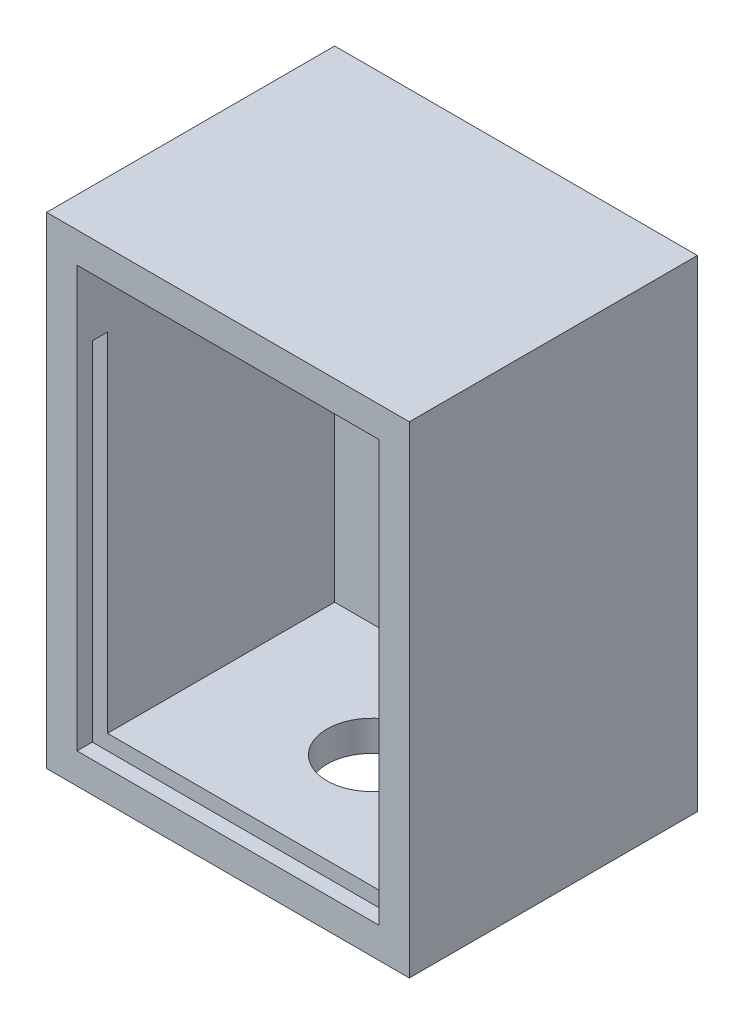
ISO-10303-21;
HEADER;
FILE_DESCRIPTION(('STEP AP214'),'2;1');
FILE_NAME('part.step','',(''),(''),'','','');
FILE_SCHEMA(('AUTOMOTIVE_DESIGN { 1 0 10303 214 1 1 1 1 }'));
ENDSEC;
DATA;
#1=APPLICATION_CONTEXT('core data for automotive mechanical design processes');
#2=APPLICATION_PROTOCOL_DEFINITION('international standard','automotive_design',2000,#1);
#3=PRODUCT_CONTEXT('',#1,'mechanical');
#4=PRODUCT('Part','Part','',(#3));
#5=PRODUCT_RELATED_PRODUCT_CATEGORY('part','',(#4));
#6=PRODUCT_DEFINITION_FORMATION('','',#4);
#7=PRODUCT_DEFINITION_CONTEXT('part definition',#1,'design');
#8=PRODUCT_DEFINITION('design','',#6,#7);
#9=PRODUCT_DEFINITION_SHAPE('','',#8);
#10=(LENGTH_UNIT() NAMED_UNIT(*) SI_UNIT(.MILLI.,.METRE.));
#11=(NAMED_UNIT(*) PLANE_ANGLE_UNIT() SI_UNIT($,.RADIAN.));
#12=(NAMED_UNIT(*) SI_UNIT($,.STERADIAN.) SOLID_ANGLE_UNIT());
#13=UNCERTAINTY_MEASURE_WITH_UNIT(LENGTH_MEASURE(1.E-05),#10,'distance_accuracy_value','');
#14=(GEOMETRIC_REPRESENTATION_CONTEXT(3) GLOBAL_UNCERTAINTY_ASSIGNED_CONTEXT((#13)) GLOBAL_UNIT_ASSIGNED_CONTEXT((#10,
#11,#12)) REPRESENTATION_CONTEXT('',''));
#15=CARTESIAN_POINT('',(0.,0.,0.));
#16=DIRECTION('',(0.,0.,1.));
#17=DIRECTION('',(1.,0.,0.));
#18=AXIS2_PLACEMENT_3D('',#15,#16,#17);
#19=CARTESIAN_POINT('',(0.,2.,0.));
#20=DIRECTION('',(0.,1.,0.));
#21=DIRECTION('',(0.,0.,1.));
#22=AXIS2_PLACEMENT_3D('',#19,#20,#21);
#23=PLANE('',#22);
#24=DIRECTION('',(1.,0.,0.));
#25=VECTOR('',#24,1.);
#26=CARTESIAN_POINT('',(0.,2.,26.6900146945383));
#27=LINE('',#26,#25);
#28=CARTESIAN_POINT('',(-94.7792504961823,2.,26.6900146945383));
#29=VERTEX_POINT('',#28);
#30=CARTESIAN_POINT('',(-74.9792504961823,2.,26.6900146945383));
#31=VERTEX_POINT('',#30);
#32=EDGE_CURVE('E55',#29,#31,#27,.T.);
#33=ORIENTED_EDGE('',*,*,#32,.F.);
#34=DIRECTION('',(0.,0.,1.));
#35=VECTOR('',#34,1.);
#36=CARTESIAN_POINT('',(-94.7792504961823,2.,8.79001469453827));
#37=LINE('',#36,#35);
#38=CARTESIAN_POINT('',(-94.7792504961823,2.,27.6900146945383));
#39=VERTEX_POINT('',#38);
#40=EDGE_CURVE('E215',#29,#39,#37,.T.);
#41=ORIENTED_EDGE('',*,*,#40,.T.);
#42=DIRECTION('',(1.,0.,0.));
#43=VECTOR('',#42,1.);
#44=CARTESIAN_POINT('',(-96.7792504961823,2.,27.6900146945383));
#45=LINE('',#44,#43);
#46=CARTESIAN_POINT('',(-74.9792504961823,2.,27.6900146945383));
#47=VERTEX_POINT('',#46);
#48=EDGE_CURVE('E219',#39,#47,#45,.T.);
#49=ORIENTED_EDGE('',*,*,#48,.T.);
#50=DIRECTION('',(0.,0.,1.));
#51=VECTOR('',#50,1.);
#52=CARTESIAN_POINT('',(-74.9792504961823,2.,8.79001469453827));
#53=LINE('',#52,#51);
#54=EDGE_CURVE('E238',#31,#47,#53,.T.);
#55=ORIENTED_EDGE('',*,*,#54,.F.);
#56=EDGE_LOOP('',(#33,#41,#49,#55));
#57=FACE_BOUND('',#56,.T.);
#58=ADVANCED_FACE('F47',(#57),#23,.T.);
#59=CARTESIAN_POINT('',(-96.7792504961823,31.6,27.6900146945383));
#60=DIRECTION('',(0.,0.,-1.));
#61=DIRECTION('',(-1.,0.,0.));
#62=AXIS2_PLACEMENT_3D('',#59,#60,#61);
#63=PLANE('',#62);
#64=DIRECTION('',(1.,0.,0.));
#65=VECTOR('',#64,1.);
#66=CARTESIAN_POINT('',(-96.7792504961823,0.,27.6900146945383));
#67=LINE('',#66,#65);
#68=CARTESIAN_POINT('',(-96.7792504961823,0.,27.6900146945383));
#69=VERTEX_POINT('',#68);
#70=CARTESIAN_POINT('',(-72.9792504961823,0.,27.6900146945383));
#71=VERTEX_POINT('',#70);
#72=EDGE_CURVE('E266',#69,#71,#67,.T.);
#73=ORIENTED_EDGE('',*,*,#72,.T.);
#74=DIRECTION('',(0.,-1.,0.));
#75=VECTOR('',#74,1.);
#76=CARTESIAN_POINT('',(-72.9792504961823,31.6,27.6900146945383));
#77=LINE('',#76,#75);
#78=CARTESIAN_POINT('',(-72.9792504961823,31.6,27.6900146945383));
#79=VERTEX_POINT('',#78);
#80=EDGE_CURVE('E277',#79,#71,#77,.T.);
#81=ORIENTED_EDGE('',*,*,#80,.F.);
#82=DIRECTION('',(1.,0.,0.));
#83=VECTOR('',#82,1.);
#84=CARTESIAN_POINT('',(-96.7792504961823,31.6,27.6900146945383));
#85=LINE('',#84,#83);
#86=CARTESIAN_POINT('',(-96.7792504961823,31.6,27.6900146945383));
#87=VERTEX_POINT('',#86);
#88=EDGE_CURVE('E254',#87,#79,#85,.T.);
#89=ORIENTED_EDGE('',*,*,#88,.F.);
#90=DIRECTION('',(0.,-1.,0.));
#91=VECTOR('',#90,1.);
#92=CARTESIAN_POINT('',(-96.7792504961823,31.6,27.6900146945383));
#93=LINE('',#92,#91);
#94=EDGE_CURVE('E279',#87,#69,#93,.T.);
#95=ORIENTED_EDGE('',*,*,#94,.T.);
#96=EDGE_LOOP('',(#73,#81,#89,#95));
#97=FACE_BOUND('',#96,.T.);
#98=ORIENTED_EDGE('',*,*,#48,.F.);
#99=DIRECTION('',(0.,-1.,0.));
#100=VECTOR('',#99,1.);
#101=CARTESIAN_POINT('',(-94.7792504961823,31.6,27.6900146945383));
#102=LINE('',#101,#100);
#103=CARTESIAN_POINT('',(-94.7792504961823,29.6,27.6900146945383));
#104=VERTEX_POINT('',#103);
#105=EDGE_CURVE('E241',#104,#39,#102,.T.);
#106=ORIENTED_EDGE('',*,*,#105,.F.);
#107=DIRECTION('',(1.,0.,0.));
#108=VECTOR('',#107,1.);
#109=CARTESIAN_POINT('',(-96.7792504961823,29.6,27.6900146945383));
#110=LINE('',#109,#108);
#111=CARTESIAN_POINT('',(-74.9792504961823,29.6,27.6900146945383));
#112=VERTEX_POINT('',#111);
#113=EDGE_CURVE('E222',#104,#112,#110,.T.);
#114=ORIENTED_EDGE('',*,*,#113,.T.);
#115=DIRECTION('',(0.,-1.,0.));
#116=VECTOR('',#115,1.);
#117=CARTESIAN_POINT('',(-74.9792504961823,31.6,27.6900146945383));
#118=LINE('',#117,#116);
#119=EDGE_CURVE('E235',#112,#47,#118,.T.);
#120=ORIENTED_EDGE('',*,*,#119,.T.);
#121=EDGE_LOOP('',(#98,#106,#114,#120));
#122=FACE_BOUND('',#121,.T.);
#123=ADVANCED_FACE('F297',(#97,#122),#63,.F.);
#124=CARTESIAN_POINT('',(-96.7792504961823,31.6,8.79001469453827));
#125=DIRECTION('',(1.,0.,0.));
#126=DIRECTION('',(0.,0.,-1.));
#127=AXIS2_PLACEMENT_3D('',#124,#125,#126);
#128=PLANE('',#127);
#129=DIRECTION('',(0.,0.,1.));
#130=VECTOR('',#129,1.);
#131=CARTESIAN_POINT('',(-96.7792504961823,0.,8.79001469453827));
#132=LINE('',#131,#130);
#133=CARTESIAN_POINT('',(-96.7792504961823,0.,8.79001469453827));
#134=VERTEX_POINT('',#133);
#135=EDGE_CURVE('E244',#134,#69,#132,.T.);
#136=ORIENTED_EDGE('',*,*,#135,.T.);
#137=ORIENTED_EDGE('',*,*,#94,.F.);
#138=DIRECTION('',(0.,0.,1.));
#139=VECTOR('',#138,1.);
#140=CARTESIAN_POINT('',(-96.7792504961823,31.6,8.79001469453827));
#141=LINE('',#140,#139);
#142=CARTESIAN_POINT('',(-96.7792504961823,31.6,8.79001469453827));
#143=VERTEX_POINT('',#142);
#144=EDGE_CURVE('E251',#143,#87,#141,.T.);
#145=ORIENTED_EDGE('',*,*,#144,.F.);
#146=DIRECTION('',(0.,-1.,0.));
#147=VECTOR('',#146,1.);
#148=CARTESIAN_POINT('',(-96.7792504961823,31.6,8.79001469453827));
#149=LINE('',#148,#147);
#150=EDGE_CURVE('E263',#143,#134,#149,.T.);
#151=ORIENTED_EDGE('',*,*,#150,.T.);
#152=EDGE_LOOP('',(#136,#137,#145,#151));
#153=FACE_BOUND('',#152,.T.);
#154=ADVANCED_FACE('F49',(#153),#128,.F.);
#155=CARTESIAN_POINT('',(-72.9792504961823,31.6,8.79001469453827));
#156=DIRECTION('',(1.,0.,0.));
#157=DIRECTION('',(0.,0.,-1.));
#158=AXIS2_PLACEMENT_3D('',#155,#156,#157);
#159=PLANE('',#158);
#160=DIRECTION('',(0.,0.,1.));
#161=VECTOR('',#160,1.);
#162=CARTESIAN_POINT('',(-72.9792504961823,0.,8.79001469453827));
#163=LINE('',#162,#161);
#164=CARTESIAN_POINT('',(-72.9792504961823,0.,8.79001469453827));
#165=VERTEX_POINT('',#164);
#166=EDGE_CURVE('E269',#165,#71,#163,.T.);
#167=ORIENTED_EDGE('',*,*,#166,.F.);
#168=DIRECTION('',(0.,-1.,0.));
#169=VECTOR('',#168,1.);
#170=CARTESIAN_POINT('',(-72.9792504961823,31.6,8.79001469453827));
#171=LINE('',#170,#169);
#172=CARTESIAN_POINT('',(-72.9792504961823,31.6,8.79001469453827));
#173=VERTEX_POINT('',#172);
#174=EDGE_CURVE('E275',#173,#165,#171,.T.);
#175=ORIENTED_EDGE('',*,*,#174,.F.);
#176=DIRECTION('',(0.,0.,1.));
#177=VECTOR('',#176,1.);
#178=CARTESIAN_POINT('',(-72.9792504961823,31.6,8.79001469453827));
#179=LINE('',#178,#177);
#180=EDGE_CURVE('E257',#173,#79,#179,.T.);
#181=ORIENTED_EDGE('',*,*,#180,.T.);
#182=ORIENTED_EDGE('',*,*,#80,.T.);
#183=EDGE_LOOP('',(#167,#175,#181,#182));
#184=FACE_BOUND('',#183,.T.);
#185=ADVANCED_FACE('F356',(#184),#159,.T.);
#186=CARTESIAN_POINT('',(-96.7792504961823,31.6,8.79001469453827));
#187=DIRECTION('',(0.,0.,-1.));
#188=DIRECTION('',(-1.,0.,0.));
#189=AXIS2_PLACEMENT_3D('',#186,#187,#188);
#190=PLANE('',#189);
#191=DIRECTION('',(1.,0.,0.));
#192=VECTOR('',#191,1.);
#193=CARTESIAN_POINT('',(-96.7792504961823,0.,8.79001469453827));
#194=LINE('',#193,#192);
#195=EDGE_CURVE('E255',#134,#165,#194,.T.);
#196=ORIENTED_EDGE('',*,*,#195,.F.);
#197=ORIENTED_EDGE('',*,*,#150,.F.);
#198=DIRECTION('',(1.,0.,0.));
#199=VECTOR('',#198,1.);
#200=CARTESIAN_POINT('',(-96.7792504961823,31.6,8.79001469453827));
#201=LINE('',#200,#199);
#202=EDGE_CURVE('E260',#143,#173,#201,.T.);
#203=ORIENTED_EDGE('',*,*,#202,.T.);
#204=ORIENTED_EDGE('',*,*,#174,.T.);
#205=EDGE_LOOP('',(#196,#197,#203,#204));
#206=FACE_BOUND('',#205,.T.);
#207=ADVANCED_FACE('F350',(#206),#190,.T.);
#208=CARTESIAN_POINT('',(0.,31.6,0.));
#209=DIRECTION('',(0.,1.,0.));
#210=DIRECTION('',(0.,0.,1.));
#211=AXIS2_PLACEMENT_3D('',#208,#209,#210);
#212=PLANE('',#211);
#213=ORIENTED_EDGE('',*,*,#144,.T.);
#214=ORIENTED_EDGE('',*,*,#88,.T.);
#215=ORIENTED_EDGE('',*,*,#180,.F.);
#216=ORIENTED_EDGE('',*,*,#202,.F.);
#217=EDGE_LOOP('',(#213,#214,#215,#216));
#218=FACE_BOUND('',#217,.T.);
#219=ADVANCED_FACE('F347',(#218),#212,.T.);
#220=CARTESIAN_POINT('',(0.,0.,0.));
#221=DIRECTION('',(0.,1.,0.));
#222=DIRECTION('',(0.,0.,1.));
#223=AXIS2_PLACEMENT_3D('',#220,#221,#222);
#224=PLANE('',#223);
#225=CARTESIAN_POINT('',(-84.8792504961823,0.,18.2400146945383));
#226=DIRECTION('',(0.,-1.,0.));
#227=DIRECTION('',(0.,0.,-1.));
#228=AXIS2_PLACEMENT_3D('',#225,#226,#227);
#229=CIRCLE('',#228,2.95);
#230=CARTESIAN_POINT('',(-84.8792504961823,0.,15.2900146945383));
#231=VERTEX_POINT('',#230);
#232=EDGE_CURVE('E188',#231,#231,#229,.T.);
#233=ORIENTED_EDGE('',*,*,#232,.F.);
#234=EDGE_LOOP('',(#233));
#235=FACE_BOUND('',#234,.T.);
#236=DIRECTION('',(1.,0.,0.));
#237=VECTOR('',#236,1.);
#238=CARTESIAN_POINT('',(-95.8385265669545,0.,25.6900146945383));
#239=LINE('',#238,#237);
#240=CARTESIAN_POINT('',(-95.8385265669545,0.,25.6900146945383));
#241=VERTEX_POINT('',#240);
#242=CARTESIAN_POINT('',(-74.0385265669545,0.,25.6900146945383));
#243=VERTEX_POINT('',#242);
#244=EDGE_CURVE('E196',#241,#243,#239,.T.);
#245=ORIENTED_EDGE('',*,*,#244,.F.);
#246=DIRECTION('',(0.,0.,-1.));
#247=VECTOR('',#246,1.);
#248=CARTESIAN_POINT('',(-95.8385265669545,0.,26.6900146945383));
#249=LINE('',#248,#247);
#250=CARTESIAN_POINT('',(-95.8385265669545,0.,26.6900146945383));
#251=VERTEX_POINT('',#250);
#252=EDGE_CURVE('E62',#251,#241,#249,.T.);
#253=ORIENTED_EDGE('',*,*,#252,.F.);
#254=DIRECTION('',(-1.,0.,0.));
#255=VECTOR('',#254,1.);
#256=CARTESIAN_POINT('',(-95.8385265669545,0.,26.6900146945383));
#257=LINE('',#256,#255);
#258=CARTESIAN_POINT('',(-74.0385265669545,0.,26.6900146945383));
#259=VERTEX_POINT('',#258);
#260=EDGE_CURVE('E182',#259,#251,#257,.T.);
#261=ORIENTED_EDGE('',*,*,#260,.F.);
#262=DIRECTION('',(0.,0.,1.));
#263=VECTOR('',#262,1.);
#264=CARTESIAN_POINT('',(-74.0385265669545,0.,26.6900146945383));
#265=LINE('',#264,#263);
#266=EDGE_CURVE('E185',#243,#259,#265,.T.);
#267=ORIENTED_EDGE('',*,*,#266,.F.);
#268=EDGE_LOOP('',(#245,#253,#261,#267));
#269=FACE_BOUND('',#268,.T.);
#270=ORIENTED_EDGE('',*,*,#135,.F.);
#271=ORIENTED_EDGE('',*,*,#195,.T.);
#272=ORIENTED_EDGE('',*,*,#166,.T.);
#273=ORIENTED_EDGE('',*,*,#72,.F.);
#274=EDGE_LOOP('',(#270,#271,#272,#273));
#275=FACE_BOUND('',#274,.T.);
#276=ADVANCED_FACE('F316',(#235,#269,#275),#224,.F.);
#277=CARTESIAN_POINT('',(-94.7792504961823,31.6,8.79001469453827));
#278=DIRECTION('',(1.,0.,0.));
#279=DIRECTION('',(0.,0.,-1.));
#280=AXIS2_PLACEMENT_3D('',#277,#278,#279);
#281=PLANE('',#280);
#282=DIRECTION('',(0.,-1.,0.));
#283=VECTOR('',#282,1.);
#284=CARTESIAN_POINT('',(-94.7792504961823,31.6,26.6900146945383));
#285=LINE('',#284,#283);
#286=CARTESIAN_POINT('',(-94.7792504961823,24.8,26.6900146945383));
#287=VERTEX_POINT('',#286);
#288=EDGE_CURVE('E211',#287,#29,#285,.T.);
#289=ORIENTED_EDGE('',*,*,#288,.F.);
#290=DIRECTION('',(0.,0.,-1.));
#291=VECTOR('',#290,1.);
#292=CARTESIAN_POINT('',(-94.7792504961823,24.8,8.79001469453827));
#293=LINE('',#292,#291);
#294=CARTESIAN_POINT('',(-94.7792504961823,24.8,25.6900146945383));
#295=VERTEX_POINT('',#294);
#296=EDGE_CURVE('E213',#287,#295,#293,.T.);
#297=ORIENTED_EDGE('',*,*,#296,.T.);
#298=DIRECTION('',(0.,1.,0.));
#299=VECTOR('',#298,1.);
#300=CARTESIAN_POINT('',(-94.7792504961823,31.6,25.6900146945383));
#301=LINE('',#300,#299);
#302=CARTESIAN_POINT('',(-94.7792504961823,2.,25.6900146945383));
#303=VERTEX_POINT('',#302);
#304=EDGE_CURVE('E172',#303,#295,#301,.T.);
#305=ORIENTED_EDGE('',*,*,#304,.F.);
#306=CARTESIAN_POINT('',(-94.7792504961823,2.,10.7900146945383));
#307=VERTEX_POINT('',#306);
#308=EDGE_CURVE('E216',#307,#303,#37,.T.);
#309=ORIENTED_EDGE('',*,*,#308,.F.);
#310=DIRECTION('',(0.,-1.,0.));
#311=VECTOR('',#310,1.);
#312=CARTESIAN_POINT('',(-94.7792504961823,31.6,10.7900146945383));
#313=LINE('',#312,#311);
#314=CARTESIAN_POINT('',(-94.7792504961823,29.6,10.7900146945383));
#315=VERTEX_POINT('',#314);
#316=EDGE_CURVE('E224',#315,#307,#313,.T.);
#317=ORIENTED_EDGE('',*,*,#316,.F.);
#318=DIRECTION('',(0.,0.,1.));
#319=VECTOR('',#318,1.);
#320=CARTESIAN_POINT('',(-94.7792504961823,29.6,8.79001469453827));
#321=LINE('',#320,#319);
#322=EDGE_CURVE('E220',#315,#104,#321,.T.);
#323=ORIENTED_EDGE('',*,*,#322,.T.);
#324=ORIENTED_EDGE('',*,*,#105,.T.);
#325=ORIENTED_EDGE('',*,*,#40,.F.);
#326=EDGE_LOOP('',(#289,#297,#305,#309,#317,#323,#324,#325));
#327=FACE_BOUND('',#326,.T.);
#328=ADVANCED_FACE('F312',(#327),#281,.T.);
#329=CARTESIAN_POINT('',(-74.9792504961823,31.6,8.79001469453827));
#330=DIRECTION('',(1.,0.,0.));
#331=DIRECTION('',(0.,0.,-1.));
#332=AXIS2_PLACEMENT_3D('',#329,#330,#331);
#333=PLANE('',#332);
#334=DIRECTION('',(0.,0.,-1.));
#335=VECTOR('',#334,1.);
#336=CARTESIAN_POINT('',(-74.9792504961823,24.8,8.79001469453827));
#337=LINE('',#336,#335);
#338=CARTESIAN_POINT('',(-74.9792504961823,24.8,26.6900146945383));
#339=VERTEX_POINT('',#338);
#340=CARTESIAN_POINT('',(-74.9792504961823,24.8,25.6900146945383));
#341=VERTEX_POINT('',#340);
#342=EDGE_CURVE('E11',#339,#341,#337,.T.);
#343=ORIENTED_EDGE('',*,*,#342,.F.);
#344=DIRECTION('',(0.,-1.,0.));
#345=VECTOR('',#344,1.);
#346=CARTESIAN_POINT('',(-74.9792504961823,31.6,26.6900146945383));
#347=LINE('',#346,#345);
#348=EDGE_CURVE('E208',#339,#31,#347,.T.);
#349=ORIENTED_EDGE('',*,*,#348,.T.);
#350=ORIENTED_EDGE('',*,*,#54,.T.);
#351=ORIENTED_EDGE('',*,*,#119,.F.);
#352=DIRECTION('',(0.,0.,1.));
#353=VECTOR('',#352,1.);
#354=CARTESIAN_POINT('',(-74.9792504961823,29.6,8.79001469453827));
#355=LINE('',#354,#353);
#356=CARTESIAN_POINT('',(-74.9792504961823,29.6,10.7900146945383));
#357=VERTEX_POINT('',#356);
#358=EDGE_CURVE('E233',#357,#112,#355,.T.);
#359=ORIENTED_EDGE('',*,*,#358,.F.);
#360=DIRECTION('',(0.,-1.,0.));
#361=VECTOR('',#360,1.);
#362=CARTESIAN_POINT('',(-74.9792504961823,31.6,10.7900146945383));
#363=LINE('',#362,#361);
#364=CARTESIAN_POINT('',(-74.9792504961823,2.,10.7900146945383));
#365=VERTEX_POINT('',#364);
#366=EDGE_CURVE('E226',#357,#365,#363,.T.);
#367=ORIENTED_EDGE('',*,*,#366,.T.);
#368=CARTESIAN_POINT('',(-74.9792504961823,2.,25.6900146945383));
#369=VERTEX_POINT('',#368);
#370=EDGE_CURVE('E230',#365,#369,#53,.T.);
#371=ORIENTED_EDGE('',*,*,#370,.T.);
#372=DIRECTION('',(0.,1.,0.));
#373=VECTOR('',#372,1.);
#374=CARTESIAN_POINT('',(-74.9792504961823,31.6,25.6900146945383));
#375=LINE('',#374,#373);
#376=EDGE_CURVE('E70',#369,#341,#375,.T.);
#377=ORIENTED_EDGE('',*,*,#376,.T.);
#378=EDGE_LOOP('',(#343,#349,#350,#351,#359,#367,#371,#377));
#379=FACE_BOUND('',#378,.T.);
#380=ADVANCED_FACE('F293',(#379),#333,.F.);
#381=CARTESIAN_POINT('',(-96.7792504961823,31.6,10.7900146945383));
#382=DIRECTION('',(0.,0.,-1.));
#383=DIRECTION('',(-1.,0.,0.));
#384=AXIS2_PLACEMENT_3D('',#381,#382,#383);
#385=PLANE('',#384);
#386=DIRECTION('',(1.,0.,0.));
#387=VECTOR('',#386,1.);
#388=CARTESIAN_POINT('',(-96.7792504961823,2.,10.7900146945383));
#389=LINE('',#388,#387);
#390=EDGE_CURVE('E223',#307,#365,#389,.T.);
#391=ORIENTED_EDGE('',*,*,#390,.T.);
#392=ORIENTED_EDGE('',*,*,#366,.F.);
#393=DIRECTION('',(1.,0.,0.));
#394=VECTOR('',#393,1.);
#395=CARTESIAN_POINT('',(-96.7792504961823,29.6,10.7900146945383));
#396=LINE('',#395,#394);
#397=EDGE_CURVE('E227',#315,#357,#396,.T.);
#398=ORIENTED_EDGE('',*,*,#397,.F.);
#399=ORIENTED_EDGE('',*,*,#316,.T.);
#400=EDGE_LOOP('',(#391,#392,#398,#399));
#401=FACE_BOUND('',#400,.T.);
#402=ADVANCED_FACE('F305',(#401),#385,.F.);
#403=CARTESIAN_POINT('',(0.,29.6,0.));
#404=DIRECTION('',(0.,1.,0.));
#405=DIRECTION('',(0.,0.,1.));
#406=AXIS2_PLACEMENT_3D('',#403,#404,#405);
#407=PLANE('',#406);
#408=ORIENTED_EDGE('',*,*,#322,.F.);
#409=ORIENTED_EDGE('',*,*,#397,.T.);
#410=ORIENTED_EDGE('',*,*,#358,.T.);
#411=ORIENTED_EDGE('',*,*,#113,.F.);
#412=EDGE_LOOP('',(#408,#409,#410,#411));
#413=FACE_BOUND('',#412,.T.);
#414=ADVANCED_FACE('F302',(#413),#407,.F.);
#415=CARTESIAN_POINT('',(-84.8792504961823,2.,18.2400146945383));
#416=DIRECTION('',(0.,-1.,0.));
#417=DIRECTION('',(0.,0.,-1.));
#418=AXIS2_PLACEMENT_3D('',#415,#416,#417);
#419=CIRCLE('',#418,2.95);
#420=CARTESIAN_POINT('',(-84.8792504961823,2.,15.2900146945383));
#421=VERTEX_POINT('',#420);
#422=EDGE_CURVE('E197',#421,#421,#419,.T.);
#423=ORIENTED_EDGE('',*,*,#422,.T.);
#424=EDGE_LOOP('',(#423));
#425=FACE_BOUND('',#424,.T.);
#426=DIRECTION('',(-1.,0.,0.));
#427=VECTOR('',#426,1.);
#428=CARTESIAN_POINT('',(0.,2.,25.6900146945383));
#429=LINE('',#428,#427);
#430=EDGE_CURVE('E282',#369,#303,#429,.T.);
#431=ORIENTED_EDGE('',*,*,#430,.F.);
#432=ORIENTED_EDGE('',*,*,#370,.F.);
#433=ORIENTED_EDGE('',*,*,#390,.F.);
#434=ORIENTED_EDGE('',*,*,#308,.T.);
#435=EDGE_LOOP('',(#431,#432,#433,#434));
#436=FACE_BOUND('',#435,.T.);
#437=ADVANCED_FACE('F310',(#425,#436),#23,.T.);
#438=CARTESIAN_POINT('',(0.,24.8,0.));
#439=DIRECTION('',(0.,-1.,0.));
#440=DIRECTION('',(0.,0.,-1.));
#441=AXIS2_PLACEMENT_3D('',#438,#439,#440);
#442=PLANE('',#441);
#443=ORIENTED_EDGE('',*,*,#342,.T.);
#444=DIRECTION('',(1.,0.,0.));
#445=VECTOR('',#444,1.);
#446=CARTESIAN_POINT('',(-95.8385265669545,24.8,25.6900146945383));
#447=LINE('',#446,#445);
#448=CARTESIAN_POINT('',(-74.0385265669545,24.8,25.6900146945383));
#449=VERTEX_POINT('',#448);
#450=EDGE_CURVE('E176',#341,#449,#447,.T.);
#451=ORIENTED_EDGE('',*,*,#450,.T.);
#452=DIRECTION('',(0.,0.,1.));
#453=VECTOR('',#452,1.);
#454=CARTESIAN_POINT('',(-74.0385265669545,24.8,26.6900146945383));
#455=LINE('',#454,#453);
#456=CARTESIAN_POINT('',(-74.0385265669545,24.8,26.6900146945383));
#457=VERTEX_POINT('',#456);
#458=EDGE_CURVE('E175',#449,#457,#455,.T.);
#459=ORIENTED_EDGE('',*,*,#458,.T.);
#460=DIRECTION('',(-1.,0.,0.));
#461=VECTOR('',#460,1.);
#462=CARTESIAN_POINT('',(-95.8385265669545,24.8,26.6900146945383));
#463=LINE('',#462,#461);
#464=EDGE_CURVE('E166',#457,#339,#463,.T.);
#465=ORIENTED_EDGE('',*,*,#464,.T.);
#466=EDGE_LOOP('',(#443,#451,#459,#465));
#467=FACE_BOUND('',#466,.T.);
#468=ADVANCED_FACE('F323',(#467),#442,.T.);
#469=CARTESIAN_POINT('',(-95.8385265669545,24.8,26.6900146945383));
#470=DIRECTION('',(-1.,0.,0.));
#471=DIRECTION('',(0.,0.,1.));
#472=AXIS2_PLACEMENT_3D('',#469,#470,#471);
#473=PLANE('',#472);
#474=ORIENTED_EDGE('',*,*,#252,.T.);
#475=DIRECTION('',(0.,-1.,0.));
#476=VECTOR('',#475,1.);
#477=CARTESIAN_POINT('',(-95.8385265669545,24.8,25.6900146945383));
#478=LINE('',#477,#476);
#479=CARTESIAN_POINT('',(-95.8385265669545,24.8,25.6900146945383));
#480=VERTEX_POINT('',#479);
#481=EDGE_CURVE('E158',#480,#241,#478,.T.);
#482=ORIENTED_EDGE('',*,*,#481,.F.);
#483=DIRECTION('',(0.,0.,-1.));
#484=VECTOR('',#483,1.);
#485=CARTESIAN_POINT('',(-95.8385265669545,24.8,26.6900146945383));
#486=LINE('',#485,#484);
#487=CARTESIAN_POINT('',(-95.8385265669545,24.8,26.6900146945383));
#488=VERTEX_POINT('',#487);
#489=EDGE_CURVE('E162',#488,#480,#486,.T.);
#490=ORIENTED_EDGE('',*,*,#489,.F.);
#491=DIRECTION('',(0.,-1.,0.));
#492=VECTOR('',#491,1.);
#493=CARTESIAN_POINT('',(-95.8385265669545,24.8,26.6900146945383));
#494=LINE('',#493,#492);
#495=EDGE_CURVE('E201',#488,#251,#494,.T.);
#496=ORIENTED_EDGE('',*,*,#495,.T.);
#497=EDGE_LOOP('',(#474,#482,#490,#496));
#498=FACE_BOUND('',#497,.T.);
#499=ADVANCED_FACE('F160',(#498),#473,.F.);
#500=CARTESIAN_POINT('',(-95.8385265669545,24.8,26.6900146945383));
#501=DIRECTION('',(0.,0.,1.));
#502=DIRECTION('',(1.,0.,0.));
#503=AXIS2_PLACEMENT_3D('',#500,#501,#502);
#504=PLANE('',#503);
#505=ORIENTED_EDGE('',*,*,#288,.T.);
#506=ORIENTED_EDGE('',*,*,#32,.T.);
#507=ORIENTED_EDGE('',*,*,#348,.F.);
#508=ORIENTED_EDGE('',*,*,#464,.F.);
#509=DIRECTION('',(0.,-1.,0.));
#510=VECTOR('',#509,1.);
#511=CARTESIAN_POINT('',(-74.0385265669545,24.8,26.6900146945383));
#512=LINE('',#511,#510);
#513=EDGE_CURVE('E203',#457,#259,#512,.T.);
#514=ORIENTED_EDGE('',*,*,#513,.T.);
#515=ORIENTED_EDGE('',*,*,#260,.T.);
#516=ORIENTED_EDGE('',*,*,#495,.F.);
#517=EDGE_CURVE('E180',#287,#488,#463,.T.);
#518=ORIENTED_EDGE('',*,*,#517,.F.);
#519=EDGE_LOOP('',(#505,#506,#507,#508,#514,#515,#516,#518));
#520=FACE_BOUND('',#519,.T.);
#521=ADVANCED_FACE('F285',(#520),#504,.F.);
#522=CARTESIAN_POINT('',(-74.0385265669545,24.8,26.6900146945383));
#523=DIRECTION('',(1.,0.,0.));
#524=DIRECTION('',(0.,0.,-1.));
#525=AXIS2_PLACEMENT_3D('',#522,#523,#524);
#526=PLANE('',#525);
#527=ORIENTED_EDGE('',*,*,#266,.T.);
#528=ORIENTED_EDGE('',*,*,#513,.F.);
#529=ORIENTED_EDGE('',*,*,#458,.F.);
#530=DIRECTION('',(0.,-1.,0.));
#531=VECTOR('',#530,1.);
#532=CARTESIAN_POINT('',(-74.0385265669545,24.8,25.6900146945383));
#533=LINE('',#532,#531);
#534=EDGE_CURVE('E165',#449,#243,#533,.T.);
#535=ORIENTED_EDGE('',*,*,#534,.T.);
#536=EDGE_LOOP('',(#527,#528,#529,#535));
#537=FACE_BOUND('',#536,.T.);
#538=ADVANCED_FACE('F321',(#537),#526,.F.);
#539=CARTESIAN_POINT('',(-95.8385265669545,24.8,25.6900146945383));
#540=DIRECTION('',(0.,0.,-1.));
#541=DIRECTION('',(-1.,0.,0.));
#542=AXIS2_PLACEMENT_3D('',#539,#540,#541);
#543=PLANE('',#542);
#544=ORIENTED_EDGE('',*,*,#304,.T.);
#545=EDGE_CURVE('E169',#480,#295,#447,.T.);
#546=ORIENTED_EDGE('',*,*,#545,.F.);
#547=ORIENTED_EDGE('',*,*,#481,.T.);
#548=ORIENTED_EDGE('',*,*,#244,.T.);
#549=ORIENTED_EDGE('',*,*,#534,.F.);
#550=ORIENTED_EDGE('',*,*,#450,.F.);
#551=ORIENTED_EDGE('',*,*,#376,.F.);
#552=ORIENTED_EDGE('',*,*,#430,.T.);
#553=EDGE_LOOP('',(#544,#546,#547,#548,#549,#550,#551,#552));
#554=FACE_BOUND('',#553,.T.);
#555=ADVANCED_FACE('F170',(#554),#543,.F.);
#556=ORIENTED_EDGE('',*,*,#517,.T.);
#557=ORIENTED_EDGE('',*,*,#489,.T.);
#558=ORIENTED_EDGE('',*,*,#545,.T.);
#559=ORIENTED_EDGE('',*,*,#296,.F.);
#560=EDGE_LOOP('',(#556,#557,#558,#559));
#561=FACE_BOUND('',#560,.T.);
#562=ADVANCED_FACE('F178',(#561),#442,.T.);
#563=CARTESIAN_POINT('',(-84.8792504961823,2.,18.2400146945383));
#564=DIRECTION('',(0.,-1.,0.));
#565=DIRECTION('',(0.,0.,-1.));
#566=AXIS2_PLACEMENT_3D('',#563,#564,#565);
#567=CYLINDRICAL_SURFACE('',#566,2.95);
#568=ORIENTED_EDGE('',*,*,#422,.F.);
#569=EDGE_LOOP('',(#568));
#570=FACE_BOUND('',#569,.T.);
#571=ORIENTED_EDGE('',*,*,#232,.T.);
#572=EDGE_LOOP('',(#571));
#573=FACE_BOUND('',#572,.T.);
#574=ADVANCED_FACE('F337',(#570,#573),#567,.F.);
#575=CLOSED_SHELL('',(#58,#123,#154,#185,#207,#219,#276,#328,#380,#402,#414,#437,#468,#499,#521,
#538,#555,#562,#574));
#576=MANIFOLD_SOLID_BREP('B2',#575);
#577=ADVANCED_BREP_SHAPE_REPRESENTATION('',(#18,#576),#14);
#578=SHAPE_DEFINITION_REPRESENTATION(#9,#577);
ENDSEC;
END-ISO-10303-21;
